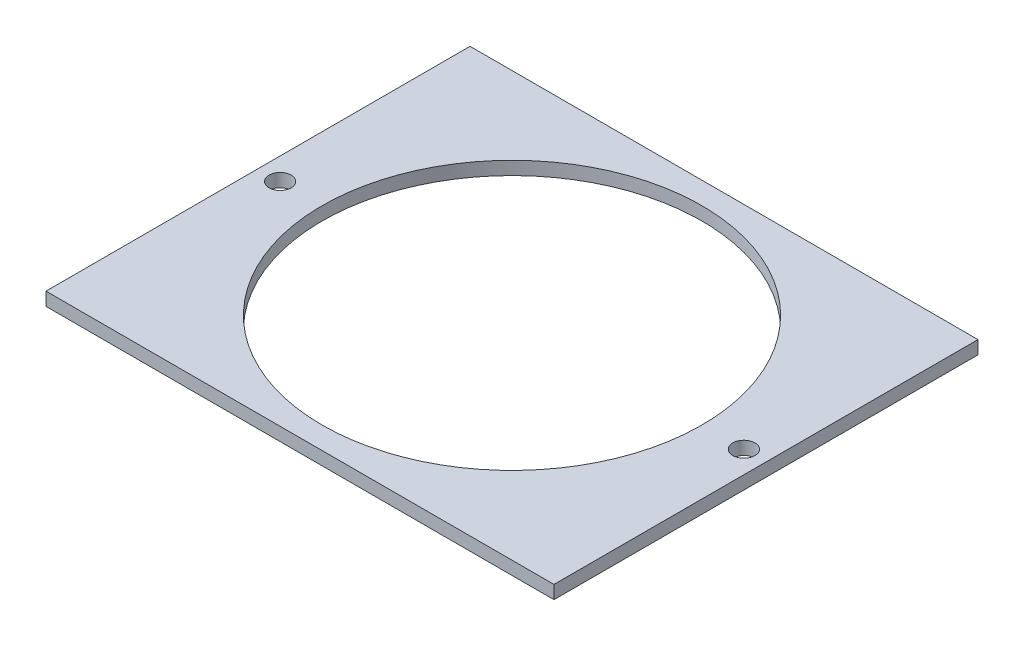
ISO-10303-21;
HEADER;
FILE_DESCRIPTION(('STEP AP214'),'2;1');
FILE_NAME('part.step','',(''),(''),'','','');
FILE_SCHEMA(('AUTOMOTIVE_DESIGN { 1 0 10303 214 1 1 1 1 }'));
ENDSEC;
DATA;
#1=APPLICATION_CONTEXT('core data for automotive mechanical design processes');
#2=APPLICATION_PROTOCOL_DEFINITION('international standard','automotive_design',2000,#1);
#3=PRODUCT_CONTEXT('',#1,'mechanical');
#4=PRODUCT('Part','Part','',(#3));
#5=PRODUCT_RELATED_PRODUCT_CATEGORY('part','',(#4));
#6=PRODUCT_DEFINITION_FORMATION('','',#4);
#7=PRODUCT_DEFINITION_CONTEXT('part definition',#1,'design');
#8=PRODUCT_DEFINITION('design','',#6,#7);
#9=PRODUCT_DEFINITION_SHAPE('','',#8);
#10=(LENGTH_UNIT() NAMED_UNIT(*) SI_UNIT(.MILLI.,.METRE.));
#11=(NAMED_UNIT(*) PLANE_ANGLE_UNIT() SI_UNIT($,.RADIAN.));
#12=(NAMED_UNIT(*) SI_UNIT($,.STERADIAN.) SOLID_ANGLE_UNIT());
#13=UNCERTAINTY_MEASURE_WITH_UNIT(LENGTH_MEASURE(1.E-05),#10,'distance_accuracy_value','');
#14=(GEOMETRIC_REPRESENTATION_CONTEXT(3) GLOBAL_UNCERTAINTY_ASSIGNED_CONTEXT((#13)) GLOBAL_UNIT_ASSIGNED_CONTEXT((#10,
#11,#12)) REPRESENTATION_CONTEXT('',''));
#15=CARTESIAN_POINT('',(0.,0.,0.));
#16=DIRECTION('',(0.,0.,1.));
#17=DIRECTION('',(1.,0.,0.));
#18=AXIS2_PLACEMENT_3D('',#15,#16,#17);
#19=CARTESIAN_POINT('',(0.,3.,0.));
#20=DIRECTION('',(0.,1.,0.));
#21=DIRECTION('',(0.,0.,1.));
#22=AXIS2_PLACEMENT_3D('',#19,#20,#21);
#23=PLANE('',#22);
#24=CARTESIAN_POINT('',(-52.5,3.,0.));
#25=DIRECTION('',(0.,1.,0.));
#26=DIRECTION('',(0.,0.,1.));
#27=AXIS2_PLACEMENT_3D('',#24,#25,#26);
#28=CIRCLE('',#27,2.5);
#29=CARTESIAN_POINT('',(-52.5,3.,2.5));
#30=VERTEX_POINT('',#29);
#31=EDGE_CURVE('E138',#30,#30,#28,.T.);
#32=ORIENTED_EDGE('',*,*,#31,.F.);
#33=EDGE_LOOP('',(#32));
#34=FACE_BOUND('',#33,.T.);
#35=DIRECTION('',(0.,0.,-1.));
#36=VECTOR('',#35,1.);
#37=CARTESIAN_POINT('',(57.5,3.,-48.));
#38=LINE('',#37,#36);
#39=CARTESIAN_POINT('',(57.5,3.,48.));
#40=VERTEX_POINT('',#39);
#41=CARTESIAN_POINT('',(57.5,3.,-48.));
#42=VERTEX_POINT('',#41);
#43=EDGE_CURVE('E96',#40,#42,#38,.T.);
#44=ORIENTED_EDGE('',*,*,#43,.T.);
#45=DIRECTION('',(-1.,0.,0.));
#46=VECTOR('',#45,1.);
#47=CARTESIAN_POINT('',(-57.5,3.,-48.));
#48=LINE('',#47,#46);
#49=CARTESIAN_POINT('',(-57.5,3.,-48.));
#50=VERTEX_POINT('',#49);
#51=EDGE_CURVE('E91',#42,#50,#48,.T.);
#52=ORIENTED_EDGE('',*,*,#51,.T.);
#53=DIRECTION('',(0.,0.,1.));
#54=VECTOR('',#53,1.);
#55=CARTESIAN_POINT('',(-57.5,3.,-48.));
#56=LINE('',#55,#54);
#57=CARTESIAN_POINT('',(-57.5,3.,48.));
#58=VERTEX_POINT('',#57);
#59=EDGE_CURVE('E94',#50,#58,#56,.T.);
#60=ORIENTED_EDGE('',*,*,#59,.T.);
#61=DIRECTION('',(1.,0.,0.));
#62=VECTOR('',#61,1.);
#63=CARTESIAN_POINT('',(-57.5,3.,48.));
#64=LINE('',#63,#62);
#65=EDGE_CURVE('E61',#58,#40,#64,.T.);
#66=ORIENTED_EDGE('',*,*,#65,.T.);
#67=EDGE_LOOP('',(#44,#52,#60,#66));
#68=FACE_BOUND('',#67,.T.);
#69=CARTESIAN_POINT('',(0.,3.,0.));
#70=DIRECTION('',(0.,1.,0.));
#71=DIRECTION('',(0.,0.,1.));
#72=AXIS2_PLACEMENT_3D('',#69,#70,#71);
#73=CIRCLE('',#72,43.);
#74=CARTESIAN_POINT('',(0.,3.,43.));
#75=VERTEX_POINT('',#74);
#76=EDGE_CURVE('E116',#75,#75,#73,.T.);
#77=ORIENTED_EDGE('',*,*,#76,.F.);
#78=EDGE_LOOP('',(#77));
#79=FACE_BOUND('',#78,.T.);
#80=CARTESIAN_POINT('',(52.5,3.,0.));
#81=DIRECTION('',(0.,1.,0.));
#82=DIRECTION('',(0.,0.,1.));
#83=AXIS2_PLACEMENT_3D('',#80,#81,#82);
#84=CIRCLE('',#83,2.5);
#85=CARTESIAN_POINT('',(52.5,3.,2.50000000000002));
#86=VERTEX_POINT('',#85);
#87=EDGE_CURVE('E146',#86,#86,#84,.T.);
#88=ORIENTED_EDGE('',*,*,#87,.F.);
#89=EDGE_LOOP('',(#88));
#90=FACE_BOUND('',#89,.T.);
#91=ADVANCED_FACE('F43',(#34,#68,#79,#90),#23,.T.);
#92=CARTESIAN_POINT('',(0.,0.,0.));
#93=DIRECTION('',(0.,1.,0.));
#94=DIRECTION('',(0.,0.,1.));
#95=AXIS2_PLACEMENT_3D('',#92,#93,#94);
#96=PLANE('',#95);
#97=DIRECTION('',(0.,0.,-1.));
#98=VECTOR('',#97,1.);
#99=CARTESIAN_POINT('',(57.5,0.,-48.));
#100=LINE('',#99,#98);
#101=CARTESIAN_POINT('',(57.5,0.,48.));
#102=VERTEX_POINT('',#101);
#103=CARTESIAN_POINT('',(57.5,0.,-48.));
#104=VERTEX_POINT('',#103);
#105=EDGE_CURVE('E112',#102,#104,#100,.T.);
#106=ORIENTED_EDGE('',*,*,#105,.F.);
#107=DIRECTION('',(1.,0.,0.));
#108=VECTOR('',#107,1.);
#109=CARTESIAN_POINT('',(-57.5,0.,48.));
#110=LINE('',#109,#108);
#111=CARTESIAN_POINT('',(-57.5,0.,48.));
#112=VERTEX_POINT('',#111);
#113=EDGE_CURVE('E84',#112,#102,#110,.T.);
#114=ORIENTED_EDGE('',*,*,#113,.F.);
#115=DIRECTION('',(0.,0.,1.));
#116=VECTOR('',#115,1.);
#117=CARTESIAN_POINT('',(-57.5,0.,-48.));
#118=LINE('',#117,#116);
#119=CARTESIAN_POINT('',(-57.5,0.,-48.));
#120=VERTEX_POINT('',#119);
#121=EDGE_CURVE('E78',#120,#112,#118,.T.);
#122=ORIENTED_EDGE('',*,*,#121,.F.);
#123=DIRECTION('',(-1.,0.,0.));
#124=VECTOR('',#123,1.);
#125=CARTESIAN_POINT('',(-57.5,0.,-48.));
#126=LINE('',#125,#124);
#127=EDGE_CURVE('E101',#104,#120,#126,.T.);
#128=ORIENTED_EDGE('',*,*,#127,.F.);
#129=EDGE_LOOP('',(#106,#114,#122,#128));
#130=FACE_BOUND('',#129,.T.);
#131=CARTESIAN_POINT('',(0.,0.,0.));
#132=DIRECTION('',(0.,1.,0.));
#133=DIRECTION('',(0.,0.,1.));
#134=AXIS2_PLACEMENT_3D('',#131,#132,#133);
#135=CIRCLE('',#134,43.);
#136=CARTESIAN_POINT('',(0.,0.,43.));
#137=VERTEX_POINT('',#136);
#138=EDGE_CURVE('E134',#137,#137,#135,.T.);
#139=ORIENTED_EDGE('',*,*,#138,.T.);
#140=EDGE_LOOP('',(#139));
#141=FACE_BOUND('',#140,.T.);
#142=CARTESIAN_POINT('',(-52.5,0.,0.));
#143=DIRECTION('',(0.,1.,0.));
#144=DIRECTION('',(0.,0.,1.));
#145=AXIS2_PLACEMENT_3D('',#142,#143,#144);
#146=CIRCLE('',#145,2.5);
#147=CARTESIAN_POINT('',(-52.5,0.,2.5));
#148=VERTEX_POINT('',#147);
#149=EDGE_CURVE('E142',#148,#148,#146,.T.);
#150=ORIENTED_EDGE('',*,*,#149,.T.);
#151=EDGE_LOOP('',(#150));
#152=FACE_BOUND('',#151,.T.);
#153=CARTESIAN_POINT('',(52.5,0.,0.));
#154=DIRECTION('',(0.,1.,0.));
#155=DIRECTION('',(0.,0.,1.));
#156=AXIS2_PLACEMENT_3D('',#153,#154,#155);
#157=CIRCLE('',#156,2.5);
#158=CARTESIAN_POINT('',(52.5,0.,2.50000000000002));
#159=VERTEX_POINT('',#158);
#160=EDGE_CURVE('E150',#159,#159,#157,.T.);
#161=ORIENTED_EDGE('',*,*,#160,.T.);
#162=EDGE_LOOP('',(#161));
#163=FACE_BOUND('',#162,.T.);
#164=ADVANCED_FACE('F129',(#130,#141,#152,#163),#96,.F.);
#165=CARTESIAN_POINT('',(57.5,3.,-48.));
#166=DIRECTION('',(-1.,0.,0.));
#167=DIRECTION('',(0.,0.,1.));
#168=AXIS2_PLACEMENT_3D('',#165,#166,#167);
#169=PLANE('',#168);
#170=ORIENTED_EDGE('',*,*,#105,.T.);
#171=DIRECTION('',(0.,-1.,0.));
#172=VECTOR('',#171,1.);
#173=CARTESIAN_POINT('',(57.5,3.,-48.));
#174=LINE('',#173,#172);
#175=EDGE_CURVE('E11',#42,#104,#174,.T.);
#176=ORIENTED_EDGE('',*,*,#175,.F.);
#177=ORIENTED_EDGE('',*,*,#43,.F.);
#178=DIRECTION('',(0.,-1.,0.));
#179=VECTOR('',#178,1.);
#180=CARTESIAN_POINT('',(57.5,3.,48.));
#181=LINE('',#180,#179);
#182=EDGE_CURVE('E108',#40,#102,#181,.T.);
#183=ORIENTED_EDGE('',*,*,#182,.T.);
#184=EDGE_LOOP('',(#170,#176,#177,#183));
#185=FACE_BOUND('',#184,.T.);
#186=ADVANCED_FACE('F45',(#185),#169,.F.);
#187=CARTESIAN_POINT('',(-57.5,3.,-48.));
#188=DIRECTION('',(0.,0.,1.));
#189=DIRECTION('',(1.,0.,0.));
#190=AXIS2_PLACEMENT_3D('',#187,#188,#189);
#191=PLANE('',#190);
#192=ORIENTED_EDGE('',*,*,#127,.T.);
#193=DIRECTION('',(0.,-1.,0.));
#194=VECTOR('',#193,1.);
#195=CARTESIAN_POINT('',(-57.5,3.,-48.));
#196=LINE('',#195,#194);
#197=EDGE_CURVE('E53',#50,#120,#196,.T.);
#198=ORIENTED_EDGE('',*,*,#197,.F.);
#199=ORIENTED_EDGE('',*,*,#51,.F.);
#200=ORIENTED_EDGE('',*,*,#175,.T.);
#201=EDGE_LOOP('',(#192,#198,#199,#200));
#202=FACE_BOUND('',#201,.T.);
#203=ADVANCED_FACE('F100',(#202),#191,.F.);
#204=CARTESIAN_POINT('',(-57.5,3.,-48.));
#205=DIRECTION('',(1.,0.,0.));
#206=DIRECTION('',(0.,0.,-1.));
#207=AXIS2_PLACEMENT_3D('',#204,#205,#206);
#208=PLANE('',#207);
#209=ORIENTED_EDGE('',*,*,#121,.T.);
#210=DIRECTION('',(0.,-1.,0.));
#211=VECTOR('',#210,1.);
#212=CARTESIAN_POINT('',(-57.5,3.,48.));
#213=LINE('',#212,#211);
#214=EDGE_CURVE('E103',#58,#112,#213,.T.);
#215=ORIENTED_EDGE('',*,*,#214,.F.);
#216=ORIENTED_EDGE('',*,*,#59,.F.);
#217=ORIENTED_EDGE('',*,*,#197,.T.);
#218=EDGE_LOOP('',(#209,#215,#216,#217));
#219=FACE_BOUND('',#218,.T.);
#220=ADVANCED_FACE('F104',(#219),#208,.F.);
#221=CARTESIAN_POINT('',(-57.5,3.,48.));
#222=DIRECTION('',(0.,0.,-1.));
#223=DIRECTION('',(-1.,0.,0.));
#224=AXIS2_PLACEMENT_3D('',#221,#222,#223);
#225=PLANE('',#224);
#226=ORIENTED_EDGE('',*,*,#113,.T.);
#227=ORIENTED_EDGE('',*,*,#182,.F.);
#228=ORIENTED_EDGE('',*,*,#65,.F.);
#229=ORIENTED_EDGE('',*,*,#214,.T.);
#230=EDGE_LOOP('',(#226,#227,#228,#229));
#231=FACE_BOUND('',#230,.T.);
#232=ADVANCED_FACE('F126',(#231),#225,.F.);
#233=CARTESIAN_POINT('',(0.,3.,0.));
#234=DIRECTION('',(0.,-1.,0.));
#235=DIRECTION('',(0.,0.,-1.));
#236=AXIS2_PLACEMENT_3D('',#233,#234,#235);
#237=CYLINDRICAL_SURFACE('',#236,43.);
#238=ORIENTED_EDGE('',*,*,#76,.T.);
#239=EDGE_LOOP('',(#238));
#240=FACE_BOUND('',#239,.T.);
#241=ORIENTED_EDGE('',*,*,#138,.F.);
#242=EDGE_LOOP('',(#241));
#243=FACE_BOUND('',#242,.T.);
#244=ADVANCED_FACE('F170',(#240,#243),#237,.F.);
#245=CARTESIAN_POINT('',(-52.5,3.,0.));
#246=DIRECTION('',(0.,-1.,0.));
#247=DIRECTION('',(0.,0.,-1.));
#248=AXIS2_PLACEMENT_3D('',#245,#246,#247);
#249=CYLINDRICAL_SURFACE('',#248,2.5);
#250=ORIENTED_EDGE('',*,*,#31,.T.);
#251=EDGE_LOOP('',(#250));
#252=FACE_BOUND('',#251,.T.);
#253=ORIENTED_EDGE('',*,*,#149,.F.);
#254=EDGE_LOOP('',(#253));
#255=FACE_BOUND('',#254,.T.);
#256=ADVANCED_FACE('F224',(#252,#255),#249,.F.);
#257=CARTESIAN_POINT('',(52.5,3.,0.));
#258=DIRECTION('',(0.,-1.,0.));
#259=DIRECTION('',(0.,0.,-1.));
#260=AXIS2_PLACEMENT_3D('',#257,#258,#259);
#261=CYLINDRICAL_SURFACE('',#260,2.5);
#262=ORIENTED_EDGE('',*,*,#87,.T.);
#263=EDGE_LOOP('',(#262));
#264=FACE_BOUND('',#263,.T.);
#265=ORIENTED_EDGE('',*,*,#160,.F.);
#266=EDGE_LOOP('',(#265));
#267=FACE_BOUND('',#266,.T.);
#268=ADVANCED_FACE('F158',(#264,#267),#261,.F.);
#269=CLOSED_SHELL('',(#91,#164,#186,#203,#220,#232,#244,#256,#268));
#270=MANIFOLD_SOLID_BREP('B2',#269);
#271=ADVANCED_BREP_SHAPE_REPRESENTATION('',(#18,#270),#14);
#272=SHAPE_DEFINITION_REPRESENTATION(#9,#271);
ENDSEC;
END-ISO-10303-21;
